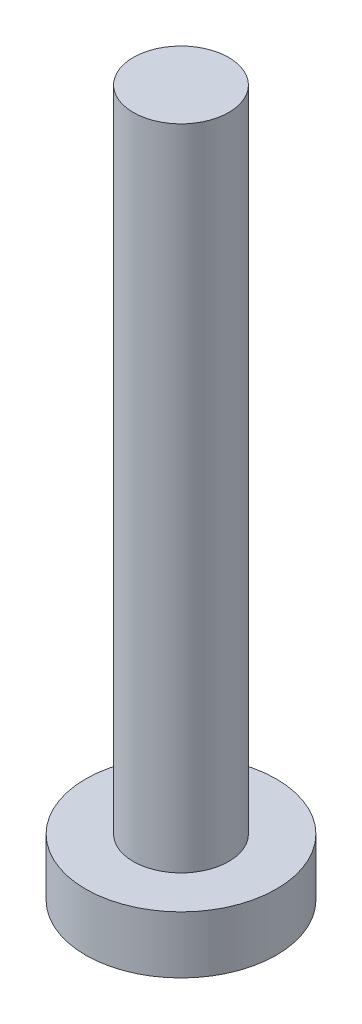
ISO-10303-21;
HEADER;
FILE_DESCRIPTION(('STEP AP214'),'2;1');
FILE_NAME('part.step','',(''),(''),'','','');
FILE_SCHEMA(('AUTOMOTIVE_DESIGN { 1 0 10303 214 1 1 1 1 }'));
ENDSEC;
DATA;
#1=APPLICATION_CONTEXT('core data for automotive mechanical design processes');
#2=APPLICATION_PROTOCOL_DEFINITION('international standard','automotive_design',2000,#1);
#3=PRODUCT_CONTEXT('',#1,'mechanical');
#4=PRODUCT('Part','Part','',(#3));
#5=PRODUCT_RELATED_PRODUCT_CATEGORY('part','',(#4));
#6=PRODUCT_DEFINITION_FORMATION('','',#4);
#7=PRODUCT_DEFINITION_CONTEXT('part definition',#1,'design');
#8=PRODUCT_DEFINITION('design','',#6,#7);
#9=PRODUCT_DEFINITION_SHAPE('','',#8);
#10=(LENGTH_UNIT() NAMED_UNIT(*) SI_UNIT(.MILLI.,.METRE.));
#11=(NAMED_UNIT(*) PLANE_ANGLE_UNIT() SI_UNIT($,.RADIAN.));
#12=(NAMED_UNIT(*) SI_UNIT($,.STERADIAN.) SOLID_ANGLE_UNIT());
#13=UNCERTAINTY_MEASURE_WITH_UNIT(LENGTH_MEASURE(1.E-05),#10,'distance_accuracy_value','');
#14=(GEOMETRIC_REPRESENTATION_CONTEXT(3) GLOBAL_UNCERTAINTY_ASSIGNED_CONTEXT((#13)) GLOBAL_UNIT_ASSIGNED_CONTEXT((#10,
#11,#12)) REPRESENTATION_CONTEXT('',''));
#15=CARTESIAN_POINT('',(0.,0.,0.));
#16=DIRECTION('',(0.,0.,1.));
#17=DIRECTION('',(1.,0.,0.));
#18=AXIS2_PLACEMENT_3D('',#15,#16,#17);
#19=CARTESIAN_POINT('',(0.,34.,0.));
#20=DIRECTION('',(0.,-1.,0.));
#21=DIRECTION('',(0.,0.,-1.));
#22=AXIS2_PLACEMENT_3D('',#19,#20,#21);
#23=CYLINDRICAL_SURFACE('',#22,2.5);
#24=CARTESIAN_POINT('',(0.,34.,0.));
#25=DIRECTION('',(0.,1.,0.));
#26=DIRECTION('',(0.,0.,1.));
#27=AXIS2_PLACEMENT_3D('',#24,#25,#26);
#28=CIRCLE('',#27,2.5);
#29=CARTESIAN_POINT('',(0.,34.,2.5));
#30=VERTEX_POINT('',#29);
#31=EDGE_CURVE('E10',#30,#30,#28,.T.);
#32=ORIENTED_EDGE('',*,*,#31,.F.);
#33=EDGE_LOOP('',(#32));
#34=FACE_BOUND('',#33,.T.);
#35=CARTESIAN_POINT('',(0.,0.,0.));
#36=DIRECTION('',(0.,1.,0.));
#37=DIRECTION('',(0.,0.,1.));
#38=AXIS2_PLACEMENT_3D('',#35,#36,#37);
#39=CIRCLE('',#38,2.5);
#40=CARTESIAN_POINT('',(0.,0.,2.5));
#41=VERTEX_POINT('',#40);
#42=EDGE_CURVE('E34',#41,#41,#39,.T.);
#43=ORIENTED_EDGE('',*,*,#42,.T.);
#44=EDGE_LOOP('',(#43));
#45=FACE_BOUND('',#44,.T.);
#46=ADVANCED_FACE('F31',(#34,#45),#23,.T.);
#47=CARTESIAN_POINT('',(0.,34.,0.));
#48=DIRECTION('',(0.,1.,0.));
#49=DIRECTION('',(0.,0.,1.));
#50=AXIS2_PLACEMENT_3D('',#47,#48,#49);
#51=PLANE('',#50);
#52=ORIENTED_EDGE('',*,*,#31,.T.);
#53=EDGE_LOOP('',(#52));
#54=FACE_BOUND('',#53,.T.);
#55=ADVANCED_FACE('F54',(#54),#51,.T.);
#56=CARTESIAN_POINT('',(0.,-3.,0.));
#57=DIRECTION('',(0.,1.,0.));
#58=DIRECTION('',(0.,0.,1.));
#59=AXIS2_PLACEMENT_3D('',#56,#57,#58);
#60=CYLINDRICAL_SURFACE('',#59,5.);
#61=CARTESIAN_POINT('',(0.,-3.,0.));
#62=DIRECTION('',(0.,-1.,0.));
#63=DIRECTION('',(0.,0.,-1.));
#64=AXIS2_PLACEMENT_3D('',#61,#62,#63);
#65=CIRCLE('',#64,5.);
#66=CARTESIAN_POINT('',(0.,-3.,-5.));
#67=VERTEX_POINT('',#66);
#68=EDGE_CURVE('E41',#67,#67,#65,.T.);
#69=ORIENTED_EDGE('',*,*,#68,.F.);
#70=EDGE_LOOP('',(#69));
#71=FACE_BOUND('',#70,.T.);
#72=CARTESIAN_POINT('',(0.,0.,0.));
#73=DIRECTION('',(0.,-1.,0.));
#74=DIRECTION('',(0.,0.,-1.));
#75=AXIS2_PLACEMENT_3D('',#72,#73,#74);
#76=CIRCLE('',#75,5.);
#77=CARTESIAN_POINT('',(0.,0.,-5.));
#78=VERTEX_POINT('',#77);
#79=EDGE_CURVE('E43',#78,#78,#76,.T.);
#80=ORIENTED_EDGE('',*,*,#79,.T.);
#81=EDGE_LOOP('',(#80));
#82=FACE_BOUND('',#81,.T.);
#83=ADVANCED_FACE('F51',(#71,#82),#60,.T.);
#84=CARTESIAN_POINT('',(0.,-3.,0.));
#85=DIRECTION('',(0.,-1.,0.));
#86=DIRECTION('',(0.,0.,-1.));
#87=AXIS2_PLACEMENT_3D('',#84,#85,#86);
#88=PLANE('',#87);
#89=ORIENTED_EDGE('',*,*,#68,.T.);
#90=EDGE_LOOP('',(#89));
#91=FACE_BOUND('',#90,.T.);
#92=ADVANCED_FACE('F49',(#91),#88,.T.);
#93=CARTESIAN_POINT('',(0.,0.,0.));
#94=DIRECTION('',(0.,-1.,0.));
#95=DIRECTION('',(0.,0.,-1.));
#96=AXIS2_PLACEMENT_3D('',#93,#94,#95);
#97=PLANE('',#96);
#98=ORIENTED_EDGE('',*,*,#42,.F.);
#99=EDGE_LOOP('',(#98));
#100=FACE_BOUND('',#99,.T.);
#101=ORIENTED_EDGE('',*,*,#79,.F.);
#102=EDGE_LOOP('',(#101));
#103=FACE_BOUND('',#102,.T.);
#104=ADVANCED_FACE('F58',(#100,#103),#97,.F.);
#105=CLOSED_SHELL('',(#46,#55,#83,#92,#104));
#106=MANIFOLD_SOLID_BREP('B2',#105);
#107=ADVANCED_BREP_SHAPE_REPRESENTATION('',(#18,#106),#14);
#108=SHAPE_DEFINITION_REPRESENTATION(#9,#107);
ENDSEC;
END-ISO-10303-21;
